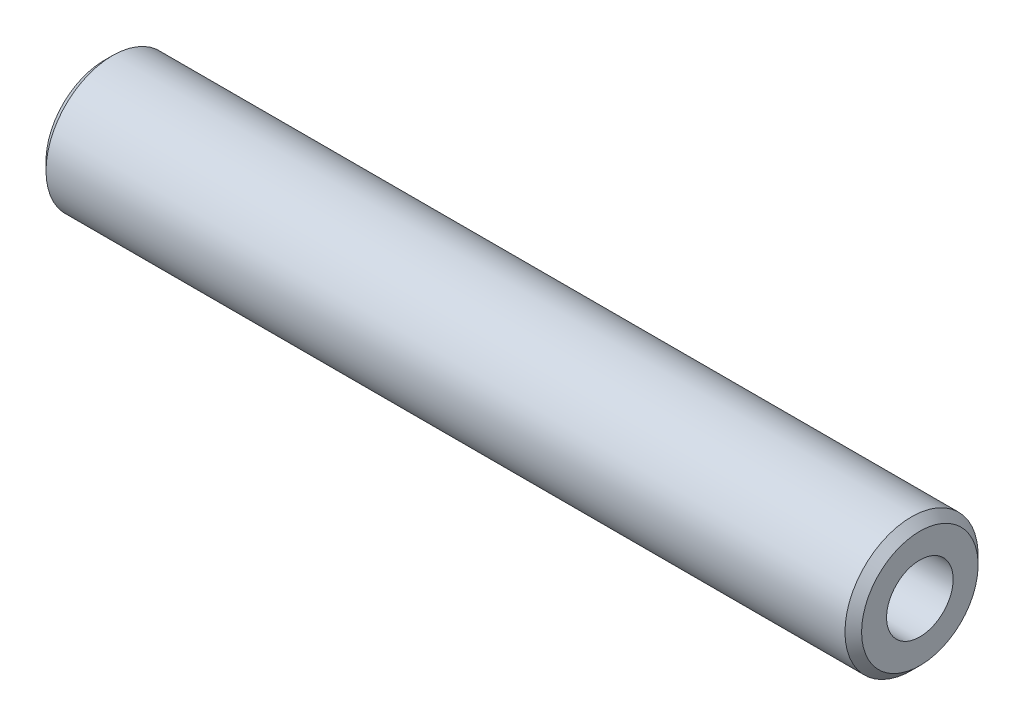
ISO-10303-21;
HEADER;
FILE_DESCRIPTION(('STEP AP214'),'2;1');
FILE_NAME('part.step','',(''),(''),'','','');
FILE_SCHEMA(('AUTOMOTIVE_DESIGN { 1 0 10303 214 1 1 1 1 }'));
ENDSEC;
DATA;
#1=APPLICATION_CONTEXT('core data for automotive mechanical design processes');
#2=APPLICATION_PROTOCOL_DEFINITION('international standard','automotive_design',2000,#1);
#3=PRODUCT_CONTEXT('',#1,'mechanical');
#4=PRODUCT('Part','Part','',(#3));
#5=PRODUCT_RELATED_PRODUCT_CATEGORY('part','',(#4));
#6=PRODUCT_DEFINITION_FORMATION('','',#4);
#7=PRODUCT_DEFINITION_CONTEXT('part definition',#1,'design');
#8=PRODUCT_DEFINITION('design','',#6,#7);
#9=PRODUCT_DEFINITION_SHAPE('','',#8);
#10=(LENGTH_UNIT() NAMED_UNIT(*) SI_UNIT(.MILLI.,.METRE.));
#11=(NAMED_UNIT(*) PLANE_ANGLE_UNIT() SI_UNIT($,.RADIAN.));
#12=(NAMED_UNIT(*) SI_UNIT($,.STERADIAN.) SOLID_ANGLE_UNIT());
#13=UNCERTAINTY_MEASURE_WITH_UNIT(LENGTH_MEASURE(1.E-05),#10,'distance_accuracy_value','');
#14=(GEOMETRIC_REPRESENTATION_CONTEXT(3) GLOBAL_UNCERTAINTY_ASSIGNED_CONTEXT((#13)) GLOBAL_UNIT_ASSIGNED_CONTEXT((#10,
#11,#12)) REPRESENTATION_CONTEXT('',''));
#15=CARTESIAN_POINT('',(0.,0.,0.));
#16=DIRECTION('',(0.,0.,1.));
#17=DIRECTION('',(1.,0.,0.));
#18=AXIS2_PLACEMENT_3D('',#15,#16,#17);
#19=CARTESIAN_POINT('',(-24.5,0.,0.));
#20=DIRECTION('',(1.,0.,0.));
#21=DIRECTION('',(0.,0.,-1.));
#22=AXIS2_PLACEMENT_3D('',#19,#20,#21);
#23=PLANE('',#22);
#24=CARTESIAN_POINT('',(-24.5,0.,0.));
#25=DIRECTION('',(1.,0.,0.));
#26=DIRECTION('',(0.,0.,-1.));
#27=AXIS2_PLACEMENT_3D('',#24,#25,#26);
#28=CIRCLE('',#27,3.5);
#29=CARTESIAN_POINT('',(-24.5,0.,-3.5));
#30=VERTEX_POINT('',#29);
#31=EDGE_CURVE('E77',#30,#30,#28,.F.);
#32=ORIENTED_EDGE('',*,*,#31,.T.);
#33=EDGE_LOOP('',(#32));
#34=FACE_BOUND('',#33,.T.);
#35=CARTESIAN_POINT('',(-24.5,0.,0.));
#36=DIRECTION('',(-1.,0.,0.));
#37=DIRECTION('',(0.,0.,1.));
#38=AXIS2_PLACEMENT_3D('',#35,#36,#37);
#39=CIRCLE('',#38,1.99999999999999);
#40=CARTESIAN_POINT('',(-24.5,0.,1.99999999999999));
#41=VERTEX_POINT('',#40);
#42=EDGE_CURVE('E58',#41,#41,#39,.T.);
#43=ORIENTED_EDGE('',*,*,#42,.F.);
#44=EDGE_LOOP('',(#43));
#45=FACE_BOUND('',#44,.T.);
#46=ADVANCED_FACE('F34',(#34,#45),#23,.F.);
#47=CARTESIAN_POINT('',(0.,0.,0.));
#48=DIRECTION('',(-1.,0.,0.));
#49=DIRECTION('',(0.,0.,1.));
#50=AXIS2_PLACEMENT_3D('',#47,#48,#49);
#51=CYLINDRICAL_SURFACE('',#50,4.);
#52=CARTESIAN_POINT('',(-24.,0.,0.));
#53=DIRECTION('',(1.,0.,0.));
#54=DIRECTION('',(0.,0.,-1.));
#55=AXIS2_PLACEMENT_3D('',#52,#53,#54);
#56=CIRCLE('',#55,4.);
#57=CARTESIAN_POINT('',(-24.,0.,-4.));
#58=VERTEX_POINT('',#57);
#59=EDGE_CURVE('E42',#58,#58,#56,.T.);
#60=ORIENTED_EDGE('',*,*,#59,.T.);
#61=EDGE_LOOP('',(#60));
#62=FACE_BOUND('',#61,.T.);
#63=CARTESIAN_POINT('',(24.,0.,0.));
#64=DIRECTION('',(-1.,0.,0.));
#65=DIRECTION('',(0.,0.,1.));
#66=AXIS2_PLACEMENT_3D('',#63,#64,#65);
#67=CIRCLE('',#66,4.);
#68=CARTESIAN_POINT('',(24.,0.,4.));
#69=VERTEX_POINT('',#68);
#70=EDGE_CURVE('E80',#69,#69,#67,.T.);
#71=ORIENTED_EDGE('',*,*,#70,.T.);
#72=EDGE_LOOP('',(#71));
#73=FACE_BOUND('',#72,.T.);
#74=ADVANCED_FACE('F85',(#62,#73),#51,.T.);
#75=CARTESIAN_POINT('',(24.5,0.,0.));
#76=DIRECTION('',(-1.,0.,0.));
#77=DIRECTION('',(0.,0.,1.));
#78=AXIS2_PLACEMENT_3D('',#75,#76,#77);
#79=PLANE('',#78);
#80=CARTESIAN_POINT('',(24.5,0.,0.));
#81=DIRECTION('',(-1.,0.,0.));
#82=DIRECTION('',(0.,0.,1.));
#83=AXIS2_PLACEMENT_3D('',#80,#81,#82);
#84=CIRCLE('',#83,3.5);
#85=CARTESIAN_POINT('',(24.5,0.,3.5));
#86=VERTEX_POINT('',#85);
#87=EDGE_CURVE('E11',#86,#86,#84,.F.);
#88=ORIENTED_EDGE('',*,*,#87,.T.);
#89=EDGE_LOOP('',(#88));
#90=FACE_BOUND('',#89,.T.);
#91=CARTESIAN_POINT('',(24.5,0.,0.));
#92=DIRECTION('',(1.,0.,0.));
#93=DIRECTION('',(0.,0.,-1.));
#94=AXIS2_PLACEMENT_3D('',#91,#92,#93);
#95=CIRCLE('',#94,1.99999999999999);
#96=CARTESIAN_POINT('',(24.5,0.,-1.99999999999999));
#97=VERTEX_POINT('',#96);
#98=EDGE_CURVE('E219',#97,#97,#95,.T.);
#99=ORIENTED_EDGE('',*,*,#98,.F.);
#100=EDGE_LOOP('',(#99));
#101=FACE_BOUND('',#100,.T.);
#102=ADVANCED_FACE('F118',(#90,#101),#79,.F.);
#103=CARTESIAN_POINT('',(-13.,0.,0.));
#104=DIRECTION('',(-1.,0.,0.));
#105=DIRECTION('',(0.,0.,1.));
#106=AXIS2_PLACEMENT_3D('',#103,#104,#105);
#107=CONICAL_SURFACE('',#106,1.65,1.02974425867665);
#108=CARTESIAN_POINT('',(-12.0085799786045,0.,0.));
#109=VERTEX_POINT('',#108);
#110=VERTEX_LOOP('',#109);
#111=FACE_BOUND('',#110,.T.);
#112=CARTESIAN_POINT('',(-13.,0.,0.));
#113=DIRECTION('',(-1.,0.,0.));
#114=DIRECTION('',(0.,0.,1.));
#115=AXIS2_PLACEMENT_3D('',#112,#113,#114);
#116=CIRCLE('',#115,1.65);
#117=CARTESIAN_POINT('',(-13.,0.,1.65));
#118=VERTEX_POINT('',#117);
#119=EDGE_CURVE('E74',#118,#118,#116,.T.);
#120=ORIENTED_EDGE('',*,*,#119,.T.);
#121=EDGE_LOOP('',(#120));
#122=FACE_BOUND('',#121,.T.);
#123=ADVANCED_FACE('F114',(#111,#122),#107,.F.);
#124=CARTESIAN_POINT('',(-24.5,0.,0.));
#125=DIRECTION('',(-1.,0.,0.));
#126=DIRECTION('',(0.,0.,1.));
#127=AXIS2_PLACEMENT_3D('',#124,#125,#126);
#128=CYLINDRICAL_SURFACE('',#127,1.65);
#129=ORIENTED_EDGE('',*,*,#119,.F.);
#130=EDGE_LOOP('',(#129));
#131=FACE_BOUND('',#130,.T.);
#132=CARTESIAN_POINT('',(-16.5,0.,0.));
#133=DIRECTION('',(-1.,0.,0.));
#134=DIRECTION('',(0.,0.,1.));
#135=AXIS2_PLACEMENT_3D('',#132,#133,#134);
#136=CIRCLE('',#135,1.65);
#137=CARTESIAN_POINT('',(-16.5,0.,1.65));
#138=VERTEX_POINT('',#137);
#139=EDGE_CURVE('E71',#138,#138,#136,.T.);
#140=ORIENTED_EDGE('',*,*,#139,.T.);
#141=EDGE_LOOP('',(#140));
#142=FACE_BOUND('',#141,.T.);
#143=ADVANCED_FACE('F106',(#131,#142),#128,.F.);
#144=CARTESIAN_POINT('',(-16.5,1.65,0.));
#145=DIRECTION('',(1.,0.,0.));
#146=DIRECTION('',(0.,0.,-1.));
#147=AXIS2_PLACEMENT_3D('',#144,#145,#146);
#148=PLANE('',#147);
#149=ORIENTED_EDGE('',*,*,#139,.F.);
#150=EDGE_LOOP('',(#149));
#151=FACE_BOUND('',#150,.T.);
#152=CARTESIAN_POINT('',(-16.5,0.,0.));
#153=DIRECTION('',(-1.,0.,0.));
#154=DIRECTION('',(0.,0.,1.));
#155=AXIS2_PLACEMENT_3D('',#152,#153,#154);
#156=CIRCLE('',#155,2.);
#157=CARTESIAN_POINT('',(-16.5,0.,2.));
#158=VERTEX_POINT('',#157);
#159=EDGE_CURVE('E62',#158,#158,#156,.T.);
#160=ORIENTED_EDGE('',*,*,#159,.T.);
#161=EDGE_LOOP('',(#160));
#162=FACE_BOUND('',#161,.T.);
#163=ADVANCED_FACE('F100',(#151,#162),#148,.F.);
#164=CARTESIAN_POINT('',(-24.5,0.,0.));
#165=DIRECTION('',(-1.,0.,0.));
#166=DIRECTION('',(0.,0.,1.));
#167=AXIS2_PLACEMENT_3D('',#164,#165,#166);
#168=CYLINDRICAL_SURFACE('',#167,1.99999999999999);
#169=ORIENTED_EDGE('',*,*,#159,.F.);
#170=EDGE_LOOP('',(#169));
#171=FACE_BOUND('',#170,.T.);
#172=ORIENTED_EDGE('',*,*,#42,.T.);
#173=EDGE_LOOP('',(#172));
#174=FACE_BOUND('',#173,.T.);
#175=ADVANCED_FACE('F52',(#171,#174),#168,.F.);
#176=CARTESIAN_POINT('',(13.,0.,0.));
#177=DIRECTION('',(1.,0.,0.));
#178=DIRECTION('',(0.,0.,-1.));
#179=AXIS2_PLACEMENT_3D('',#176,#177,#178);
#180=CONICAL_SURFACE('',#179,1.65,1.02974425867665);
#181=CARTESIAN_POINT('',(12.0085799786045,0.,0.));
#182=VERTEX_POINT('',#181);
#183=VERTEX_LOOP('',#182);
#184=FACE_BOUND('',#183,.T.);
#185=CARTESIAN_POINT('',(13.,0.,0.));
#186=DIRECTION('',(1.,0.,0.));
#187=DIRECTION('',(0.,0.,-1.));
#188=AXIS2_PLACEMENT_3D('',#185,#186,#187);
#189=CIRCLE('',#188,1.65);
#190=CARTESIAN_POINT('',(13.,0.,-1.65));
#191=VERTEX_POINT('',#190);
#192=EDGE_CURVE('E56',#191,#191,#189,.T.);
#193=ORIENTED_EDGE('',*,*,#192,.T.);
#194=EDGE_LOOP('',(#193));
#195=FACE_BOUND('',#194,.T.);
#196=ADVANCED_FACE('F48',(#184,#195),#180,.F.);
#197=CARTESIAN_POINT('',(24.5,0.,0.));
#198=DIRECTION('',(1.,0.,0.));
#199=DIRECTION('',(0.,0.,-1.));
#200=AXIS2_PLACEMENT_3D('',#197,#198,#199);
#201=CYLINDRICAL_SURFACE('',#200,1.65);
#202=ORIENTED_EDGE('',*,*,#192,.F.);
#203=EDGE_LOOP('',(#202));
#204=FACE_BOUND('',#203,.T.);
#205=CARTESIAN_POINT('',(16.5,0.,0.));
#206=DIRECTION('',(1.,0.,0.));
#207=DIRECTION('',(0.,0.,-1.));
#208=AXIS2_PLACEMENT_3D('',#205,#206,#207);
#209=CIRCLE('',#208,1.65);
#210=CARTESIAN_POINT('',(16.5,0.,-1.65));
#211=VERTEX_POINT('',#210);
#212=EDGE_CURVE('E59',#211,#211,#209,.T.);
#213=ORIENTED_EDGE('',*,*,#212,.T.);
#214=EDGE_LOOP('',(#213));
#215=FACE_BOUND('',#214,.T.);
#216=ADVANCED_FACE('F51',(#204,#215),#201,.F.);
#217=CARTESIAN_POINT('',(16.5,1.65,0.));
#218=DIRECTION('',(-1.,0.,0.));
#219=DIRECTION('',(0.,0.,1.));
#220=AXIS2_PLACEMENT_3D('',#217,#218,#219);
#221=PLANE('',#220);
#222=ORIENTED_EDGE('',*,*,#212,.F.);
#223=EDGE_LOOP('',(#222));
#224=FACE_BOUND('',#223,.T.);
#225=CARTESIAN_POINT('',(16.5,0.,0.));
#226=DIRECTION('',(1.,0.,0.));
#227=DIRECTION('',(0.,0.,-1.));
#228=AXIS2_PLACEMENT_3D('',#225,#226,#227);
#229=CIRCLE('',#228,2.);
#230=CARTESIAN_POINT('',(16.5,0.,-2.));
#231=VERTEX_POINT('',#230);
#232=EDGE_CURVE('E65',#231,#231,#229,.T.);
#233=ORIENTED_EDGE('',*,*,#232,.T.);
#234=EDGE_LOOP('',(#233));
#235=FACE_BOUND('',#234,.T.);
#236=ADVANCED_FACE('F166',(#224,#235),#221,.F.);
#237=CARTESIAN_POINT('',(24.5,0.,0.));
#238=DIRECTION('',(1.,0.,0.));
#239=DIRECTION('',(0.,0.,-1.));
#240=AXIS2_PLACEMENT_3D('',#237,#238,#239);
#241=CYLINDRICAL_SURFACE('',#240,1.99999999999999);
#242=ORIENTED_EDGE('',*,*,#232,.F.);
#243=EDGE_LOOP('',(#242));
#244=FACE_BOUND('',#243,.T.);
#245=ORIENTED_EDGE('',*,*,#98,.T.);
#246=EDGE_LOOP('',(#245));
#247=FACE_BOUND('',#246,.T.);
#248=ADVANCED_FACE('F91',(#244,#247),#241,.F.);
#249=CARTESIAN_POINT('',(-24.5,0.,0.));
#250=DIRECTION('',(1.,0.,0.));
#251=DIRECTION('',(0.,0.,-1.));
#252=AXIS2_PLACEMENT_3D('',#249,#250,#251);
#253=CONICAL_SURFACE('',#252,3.5,0.785398163397449);
#254=ORIENTED_EDGE('',*,*,#59,.F.);
#255=EDGE_LOOP('',(#254));
#256=FACE_BOUND('',#255,.T.);
#257=ORIENTED_EDGE('',*,*,#31,.F.);
#258=EDGE_LOOP('',(#257));
#259=FACE_BOUND('',#258,.T.);
#260=ADVANCED_FACE('F88',(#256,#259),#253,.T.);
#261=CARTESIAN_POINT('',(24.,0.,0.));
#262=DIRECTION('',(-1.,0.,0.));
#263=DIRECTION('',(0.,0.,1.));
#264=AXIS2_PLACEMENT_3D('',#261,#262,#263);
#265=CONICAL_SURFACE('',#264,4.,0.785398163397456);
#266=ORIENTED_EDGE('',*,*,#87,.F.);
#267=EDGE_LOOP('',(#266));
#268=FACE_BOUND('',#267,.T.);
#269=ORIENTED_EDGE('',*,*,#70,.F.);
#270=EDGE_LOOP('',(#269));
#271=FACE_BOUND('',#270,.T.);
#272=ADVANCED_FACE('F36',(#268,#271),#265,.T.);
#273=CLOSED_SHELL('',(#46,#74,#102,#123,#143,#163,#175,#196,#216,#236,#248,#260,#272));
#274=MANIFOLD_SOLID_BREP('B2',#273);
#275=ADVANCED_BREP_SHAPE_REPRESENTATION('',(#18,#274),#14);
#276=SHAPE_DEFINITION_REPRESENTATION(#9,#275);
ENDSEC;
END-ISO-10303-21;
